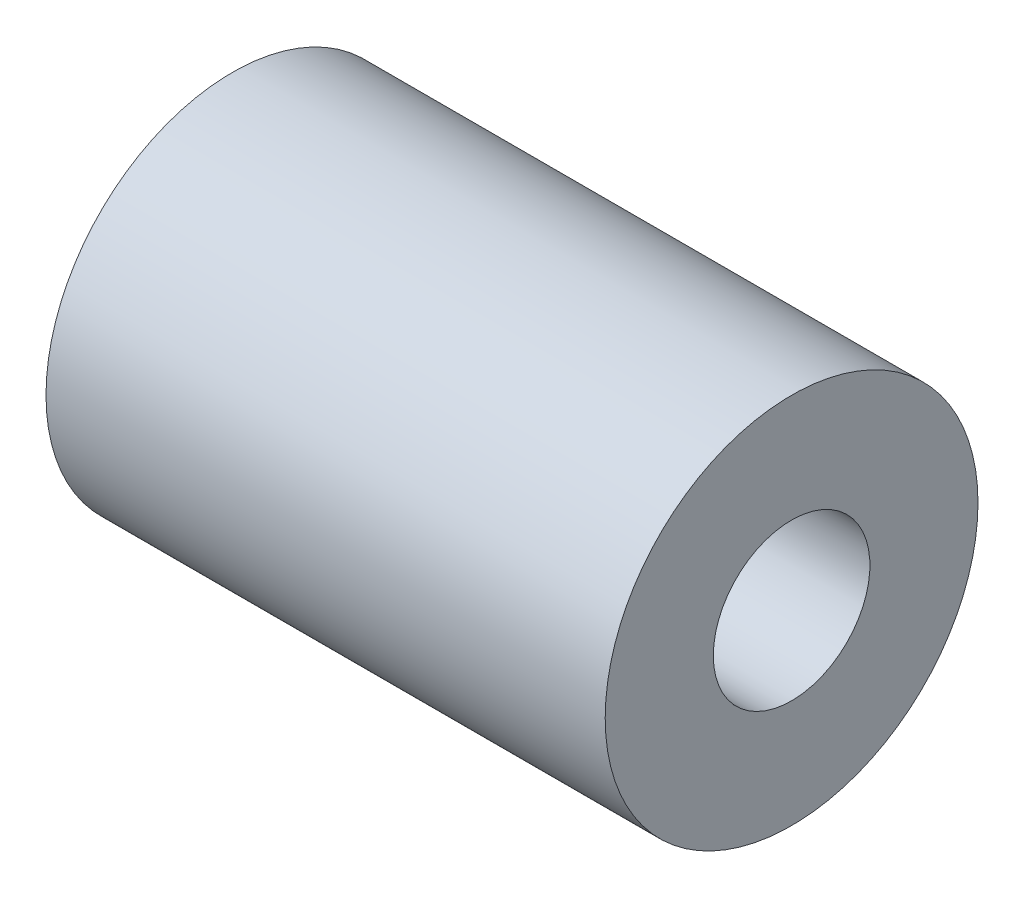
ISO-10303-21;
HEADER;
FILE_DESCRIPTION(('STEP AP214'),'2;1');
FILE_NAME('part.step','',(''),(''),'','','');
FILE_SCHEMA(('AUTOMOTIVE_DESIGN { 1 0 10303 214 1 1 1 1 }'));
ENDSEC;
DATA;
#1=APPLICATION_CONTEXT('core data for automotive mechanical design processes');
#2=APPLICATION_PROTOCOL_DEFINITION('international standard','automotive_design',2000,#1);
#3=PRODUCT_CONTEXT('',#1,'mechanical');
#4=PRODUCT('Part','Part','',(#3));
#5=PRODUCT_RELATED_PRODUCT_CATEGORY('part','',(#4));
#6=PRODUCT_DEFINITION_FORMATION('','',#4);
#7=PRODUCT_DEFINITION_CONTEXT('part definition',#1,'design');
#8=PRODUCT_DEFINITION('design','',#6,#7);
#9=PRODUCT_DEFINITION_SHAPE('','',#8);
#10=(LENGTH_UNIT() NAMED_UNIT(*) SI_UNIT(.MILLI.,.METRE.));
#11=(NAMED_UNIT(*) PLANE_ANGLE_UNIT() SI_UNIT($,.RADIAN.));
#12=(NAMED_UNIT(*) SI_UNIT($,.STERADIAN.) SOLID_ANGLE_UNIT());
#13=UNCERTAINTY_MEASURE_WITH_UNIT(LENGTH_MEASURE(1.E-05),#10,'distance_accuracy_value','');
#14=(GEOMETRIC_REPRESENTATION_CONTEXT(3) GLOBAL_UNCERTAINTY_ASSIGNED_CONTEXT((#13)) GLOBAL_UNIT_ASSIGNED_CONTEXT((#10,
#11,#12)) REPRESENTATION_CONTEXT('',''));
#15=CARTESIAN_POINT('',(0.,0.,0.));
#16=DIRECTION('',(0.,0.,1.));
#17=DIRECTION('',(1.,0.,0.));
#18=AXIS2_PLACEMENT_3D('',#15,#16,#17);
#19=CARTESIAN_POINT('',(38.1,0.,0.));
#20=DIRECTION('',(-1.,0.,0.));
#21=DIRECTION('',(0.,0.,1.));
#22=AXIS2_PLACEMENT_3D('',#19,#20,#21);
#23=CYLINDRICAL_SURFACE('',#22,10.67);
#24=CARTESIAN_POINT('',(38.1,0.,0.));
#25=DIRECTION('',(1.,0.,0.));
#26=DIRECTION('',(0.,0.,-1.));
#27=AXIS2_PLACEMENT_3D('',#24,#25,#26);
#28=CIRCLE('',#27,10.67);
#29=CARTESIAN_POINT('',(38.1,0.,10.67));
#30=VERTEX_POINT('',#29);
#31=EDGE_CURVE('E47',#30,#30,#28,.T.);
#32=CARTESIAN_POINT('',(-38.1,0.,0.));
#33=DIRECTION('',(1.,0.,0.));
#34=DIRECTION('',(0.,0.,-1.));
#35=AXIS2_PLACEMENT_3D('',#32,#33,#34);
#36=CIRCLE('',#35,10.67);
#37=CARTESIAN_POINT('',(-38.1,0.,10.67));
#38=VERTEX_POINT('',#37);
#39=EDGE_CURVE('E54',#38,#38,#36,.T.);
#40=CARTESIAN_POINT('',(38.1,0.,10.67));
#41=CARTESIAN_POINT('',(37.30625,0.,10.67));
#42=CARTESIAN_POINT('',(36.5125,0.,10.67));
#43=CARTESIAN_POINT('',(34.925,0.,10.67));
#44=CARTESIAN_POINT('',(34.13125,0.,10.67));
#45=CARTESIAN_POINT('',(32.54375,0.,10.67));
#46=CARTESIAN_POINT('',(31.75,0.,10.67));
#47=CARTESIAN_POINT('',(30.1625,0.,10.67));
#48=CARTESIAN_POINT('',(29.36875,0.,10.67));
#49=CARTESIAN_POINT('',(27.78125,0.,10.67));
#50=CARTESIAN_POINT('',(26.9875,0.,10.67));
#51=CARTESIAN_POINT('',(25.4,0.,10.67));
#52=CARTESIAN_POINT('',(24.60625,0.,10.67));
#53=CARTESIAN_POINT('',(23.01875,0.,10.67));
#54=CARTESIAN_POINT('',(22.225,0.,10.67));
#55=CARTESIAN_POINT('',(20.6375,0.,10.67));
#56=CARTESIAN_POINT('',(19.84375,0.,10.67));
#57=CARTESIAN_POINT('',(18.25625,0.,10.67));
#58=CARTESIAN_POINT('',(17.4625,0.,10.67));
#59=CARTESIAN_POINT('',(15.875,0.,10.67));
#60=CARTESIAN_POINT('',(15.08125,0.,10.67));
#61=CARTESIAN_POINT('',(13.49375,0.,10.67));
#62=CARTESIAN_POINT('',(12.7,0.,10.67));
#63=CARTESIAN_POINT('',(11.1125,0.,10.67));
#64=CARTESIAN_POINT('',(10.31875,0.,10.67));
#65=CARTESIAN_POINT('',(8.73124999999999,0.,10.67));
#66=CARTESIAN_POINT('',(7.93749999999999,0.,10.67));
#67=CARTESIAN_POINT('',(6.34999999999999,0.,10.67));
#68=CARTESIAN_POINT('',(5.55625,0.,10.67));
#69=CARTESIAN_POINT('',(3.96875,0.,10.67));
#70=CARTESIAN_POINT('',(3.17499999999999,0.,10.67));
#71=CARTESIAN_POINT('',(1.58749999999999,0.,10.67));
#72=CARTESIAN_POINT('',(0.793749999999994,0.,10.67));
#73=CARTESIAN_POINT('',(-0.793750000000007,0.,10.67));
#74=CARTESIAN_POINT('',(-1.58750000000001,0.,10.67));
#75=CARTESIAN_POINT('',(-3.17500000000001,0.,10.67));
#76=CARTESIAN_POINT('',(-3.96875000000001,0.,10.67));
#77=CARTESIAN_POINT('',(-5.55625000000001,0.,10.67));
#78=CARTESIAN_POINT('',(-6.35000000000001,0.,10.67));
#79=CARTESIAN_POINT('',(-7.93750000000001,0.,10.67));
#80=CARTESIAN_POINT('',(-8.73125000000001,0.,10.67));
#81=CARTESIAN_POINT('',(-10.31875,0.,10.67));
#82=CARTESIAN_POINT('',(-11.1125,0.,10.67));
#83=CARTESIAN_POINT('',(-12.7,0.,10.67));
#84=CARTESIAN_POINT('',(-13.49375,0.,10.67));
#85=CARTESIAN_POINT('',(-15.08125,0.,10.67));
#86=CARTESIAN_POINT('',(-15.875,0.,10.67));
#87=CARTESIAN_POINT('',(-17.4625,0.,10.67));
#88=CARTESIAN_POINT('',(-18.25625,0.,10.67));
#89=CARTESIAN_POINT('',(-19.84375,0.,10.67));
#90=CARTESIAN_POINT('',(-20.6375,0.,10.67));
#91=CARTESIAN_POINT('',(-22.225,0.,10.67));
#92=CARTESIAN_POINT('',(-23.01875,0.,10.67));
#93=CARTESIAN_POINT('',(-24.60625,0.,10.67));
#94=CARTESIAN_POINT('',(-25.4,0.,10.67));
#95=CARTESIAN_POINT('',(-26.9875,0.,10.67));
#96=CARTESIAN_POINT('',(-27.78125,0.,10.67));
#97=CARTESIAN_POINT('',(-29.36875,0.,10.67));
#98=CARTESIAN_POINT('',(-30.1625,0.,10.67));
#99=CARTESIAN_POINT('',(-31.75,0.,10.67));
#100=CARTESIAN_POINT('',(-32.54375,0.,10.67));
#101=CARTESIAN_POINT('',(-34.13125,0.,10.67));
#102=CARTESIAN_POINT('',(-34.925,0.,10.67));
#103=CARTESIAN_POINT('',(-36.5125,0.,10.67));
#104=CARTESIAN_POINT('',(-37.30625,0.,10.67));
#105=CARTESIAN_POINT('',(-38.1,0.,10.67));
#106=B_SPLINE_CURVE_WITH_KNOTS('',3,(#40,#41,#42,#43,#44,#45,#46,#47,#48,#49,#50,#51,#52,#53,
#54,#55,#56,#57,#58,#59,#60,#61,#62,#63,#64,#65,#66,#67,#68,#69,#70,#71,#72,#73,#74,#75,#76,#77,
#78,#79,#80,#81,#82,#83,#84,#85,#86,#87,#88,#89,#90,#91,#92,#93,#94,#95,#96,#97,#98,#99,#100,
#101,#102,#103,#104,#105),.UNSPECIFIED.,.F.,.F.,(4,2,2,2,2,2,2,2,2,2,2,2,2,2,2,2,2,2,2,2,2,2,2,
2,2,2,2,2,2,2,2,2,4),(0.,2.38124999999999,4.7625,7.14375,9.525,11.90625,14.2875,16.66875,19.05,
21.43125,23.8125,26.19375,28.575,30.95625,33.3375,35.71875,38.1,40.48125,42.8625,45.24375,
47.625,50.00625,52.3875,54.76875,57.15,59.53125,61.9125,64.29375,66.675,69.05625,71.4375,
73.81875,76.2),.UNSPECIFIED.);
#107=EDGE_CURVE('BSEAM39',#30,#38,#106,.T.);
#108=ORIENTED_EDGE('',*,*,#31,.T.);
#109=ORIENTED_EDGE('',*,*,#39,.F.);
#110=ORIENTED_EDGE('',*,*,#107,.T.);
#111=ORIENTED_EDGE('',*,*,#107,.F.);
#112=EDGE_LOOP('',(#108,#110,#109,#111));
#113=FACE_BOUND('',#112,.T.);
#114=ADVANCED_FACE('F39',(#113),#23,.F.);
#115=CARTESIAN_POINT('',(38.1,0.,0.));
#116=DIRECTION('',(-1.,0.,0.));
#117=DIRECTION('',(0.,0.,1.));
#118=AXIS2_PLACEMENT_3D('',#115,#116,#117);
#119=CYLINDRICAL_SURFACE('',#118,25.4);
#120=CARTESIAN_POINT('',(38.1,0.,0.));
#121=DIRECTION('',(1.,0.,0.));
#122=DIRECTION('',(0.,0.,-1.));
#123=AXIS2_PLACEMENT_3D('',#120,#121,#122);
#124=CIRCLE('',#123,25.4);
#125=CARTESIAN_POINT('',(38.1,0.,25.4));
#126=VERTEX_POINT('',#125);
#127=EDGE_CURVE('E10',#126,#126,#124,.T.);
#128=CARTESIAN_POINT('',(-38.1,0.,0.));
#129=DIRECTION('',(1.,0.,0.));
#130=DIRECTION('',(0.,0.,-1.));
#131=AXIS2_PLACEMENT_3D('',#128,#129,#130);
#132=CIRCLE('',#131,25.4);
#133=CARTESIAN_POINT('',(-38.1,0.,25.4));
#134=VERTEX_POINT('',#133);
#135=EDGE_CURVE('E42',#134,#134,#132,.T.);
#136=CARTESIAN_POINT('',(38.1,0.,25.4));
#137=CARTESIAN_POINT('',(37.30625,0.,25.4));
#138=CARTESIAN_POINT('',(36.5125,0.,25.4));
#139=CARTESIAN_POINT('',(34.925,0.,25.4));
#140=CARTESIAN_POINT('',(34.13125,0.,25.4));
#141=CARTESIAN_POINT('',(32.54375,0.,25.4));
#142=CARTESIAN_POINT('',(31.75,0.,25.4));
#143=CARTESIAN_POINT('',(30.1625,0.,25.4));
#144=CARTESIAN_POINT('',(29.36875,0.,25.4));
#145=CARTESIAN_POINT('',(27.78125,0.,25.4));
#146=CARTESIAN_POINT('',(26.9875,0.,25.4));
#147=CARTESIAN_POINT('',(25.4,0.,25.4));
#148=CARTESIAN_POINT('',(24.60625,0.,25.4));
#149=CARTESIAN_POINT('',(23.01875,0.,25.4));
#150=CARTESIAN_POINT('',(22.225,0.,25.4));
#151=CARTESIAN_POINT('',(20.6375,0.,25.4));
#152=CARTESIAN_POINT('',(19.84375,0.,25.4));
#153=CARTESIAN_POINT('',(18.25625,0.,25.4));
#154=CARTESIAN_POINT('',(17.4625,0.,25.4));
#155=CARTESIAN_POINT('',(15.875,0.,25.4));
#156=CARTESIAN_POINT('',(15.08125,0.,25.4));
#157=CARTESIAN_POINT('',(13.49375,0.,25.4));
#158=CARTESIAN_POINT('',(12.7,0.,25.4));
#159=CARTESIAN_POINT('',(11.1125,0.,25.4));
#160=CARTESIAN_POINT('',(10.31875,0.,25.4));
#161=CARTESIAN_POINT('',(8.73124999999999,0.,25.4));
#162=CARTESIAN_POINT('',(7.93749999999999,0.,25.4));
#163=CARTESIAN_POINT('',(6.35,0.,25.4));
#164=CARTESIAN_POINT('',(5.55625,0.,25.4));
#165=CARTESIAN_POINT('',(3.96875,0.,25.4));
#166=CARTESIAN_POINT('',(3.175,0.,25.4));
#167=CARTESIAN_POINT('',(1.5875,0.,25.4));
#168=CARTESIAN_POINT('',(0.793750000000001,0.,25.4));
#169=CARTESIAN_POINT('',(-0.793750000000001,0.,25.4));
#170=CARTESIAN_POINT('',(-1.5875,0.,25.4));
#171=CARTESIAN_POINT('',(-3.175,0.,25.4));
#172=CARTESIAN_POINT('',(-3.96875,0.,25.4));
#173=CARTESIAN_POINT('',(-5.55625,0.,25.4));
#174=CARTESIAN_POINT('',(-6.35,0.,25.4));
#175=CARTESIAN_POINT('',(-7.93750000000001,0.,25.4));
#176=CARTESIAN_POINT('',(-8.73125,0.,25.4));
#177=CARTESIAN_POINT('',(-10.31875,0.,25.4));
#178=CARTESIAN_POINT('',(-11.1125,0.,25.4));
#179=CARTESIAN_POINT('',(-12.7,0.,25.4));
#180=CARTESIAN_POINT('',(-13.49375,0.,25.4));
#181=CARTESIAN_POINT('',(-15.08125,0.,25.4));
#182=CARTESIAN_POINT('',(-15.875,0.,25.4));
#183=CARTESIAN_POINT('',(-17.4625,0.,25.4));
#184=CARTESIAN_POINT('',(-18.25625,0.,25.4));
#185=CARTESIAN_POINT('',(-19.84375,0.,25.4));
#186=CARTESIAN_POINT('',(-20.6375,0.,25.4));
#187=CARTESIAN_POINT('',(-22.225,0.,25.4));
#188=CARTESIAN_POINT('',(-23.01875,0.,25.4));
#189=CARTESIAN_POINT('',(-24.60625,0.,25.4));
#190=CARTESIAN_POINT('',(-25.4,0.,25.4));
#191=CARTESIAN_POINT('',(-26.9875,0.,25.4));
#192=CARTESIAN_POINT('',(-27.78125,0.,25.4));
#193=CARTESIAN_POINT('',(-29.36875,0.,25.4));
#194=CARTESIAN_POINT('',(-30.1625,0.,25.4));
#195=CARTESIAN_POINT('',(-31.75,0.,25.4));
#196=CARTESIAN_POINT('',(-32.54375,0.,25.4));
#197=CARTESIAN_POINT('',(-34.13125,0.,25.4));
#198=CARTESIAN_POINT('',(-34.925,0.,25.4));
#199=CARTESIAN_POINT('',(-36.5125,0.,25.4));
#200=CARTESIAN_POINT('',(-37.30625,0.,25.4));
#201=CARTESIAN_POINT('',(-38.1,0.,25.4));
#202=B_SPLINE_CURVE_WITH_KNOTS('',3,(#136,#137,#138,#139,#140,#141,#142,#143,#144,#145,#146,
#147,#148,#149,#150,#151,#152,#153,#154,#155,#156,#157,#158,#159,#160,#161,#162,#163,#164,#165,
#166,#167,#168,#169,#170,#171,#172,#173,#174,#175,#176,#177,#178,#179,#180,#181,#182,#183,#184,
#185,#186,#187,#188,#189,#190,#191,#192,#193,#194,#195,#196,#197,#198,#199,#200,#201),
.UNSPECIFIED.,.F.,.F.,(4,2,2,2,2,2,2,2,2,2,2,2,2,2,2,2,2,2,2,2,2,2,2,2,2,2,2,2,2,2,2,2,4),(0.,
2.38125,4.7625,7.14375,9.52500000000001,11.90625,14.2875,16.66875,19.05,21.43125,23.8125,
26.19375,28.575,30.95625,33.3375,35.71875,38.1,40.48125,42.8625,45.24375,47.625,50.00625,
52.3875,54.76875,57.15,59.53125,61.9125,64.29375,66.675,69.05625,71.4375,73.81875,76.2),.UNSPECIFIED.);
#203=EDGE_CURVE('BSEAM63',#126,#134,#202,.T.);
#204=ORIENTED_EDGE('',*,*,#127,.F.);
#205=ORIENTED_EDGE('',*,*,#135,.T.);
#206=ORIENTED_EDGE('',*,*,#203,.T.);
#207=ORIENTED_EDGE('',*,*,#203,.F.);
#208=EDGE_LOOP('',(#204,#206,#205,#207));
#209=FACE_BOUND('',#208,.T.);
#210=ADVANCED_FACE('F63',(#209),#119,.T.);
#211=CARTESIAN_POINT('',(38.1,0.,0.));
#212=DIRECTION('',(1.,0.,0.));
#213=DIRECTION('',(0.,0.,-1.));
#214=AXIS2_PLACEMENT_3D('',#211,#212,#213);
#215=PLANE('',#214);
#216=ORIENTED_EDGE('',*,*,#31,.F.);
#217=EDGE_LOOP('',(#216));
#218=FACE_BOUND('',#217,.T.);
#219=ORIENTED_EDGE('',*,*,#127,.T.);
#220=EDGE_LOOP('',(#219));
#221=FACE_BOUND('',#220,.T.);
#222=ADVANCED_FACE('F67',(#218,#221),#215,.T.);
#223=CARTESIAN_POINT('',(-38.1,0.,0.));
#224=DIRECTION('',(1.,0.,0.));
#225=DIRECTION('',(0.,0.,-1.));
#226=AXIS2_PLACEMENT_3D('',#223,#224,#225);
#227=PLANE('',#226);
#228=ORIENTED_EDGE('',*,*,#39,.T.);
#229=EDGE_LOOP('',(#228));
#230=FACE_BOUND('',#229,.T.);
#231=ORIENTED_EDGE('',*,*,#135,.F.);
#232=EDGE_LOOP('',(#231));
#233=FACE_BOUND('',#232,.T.);
#234=ADVANCED_FACE('F65',(#230,#233),#227,.F.);
#235=CLOSED_SHELL('',(#114,#210,#222,#234));
#236=MANIFOLD_SOLID_BREP('B2',#235);
#237=ADVANCED_BREP_SHAPE_REPRESENTATION('',(#18,#236),#14);
#238=SHAPE_DEFINITION_REPRESENTATION(#9,#237);
ENDSEC;
END-ISO-10303-21;
